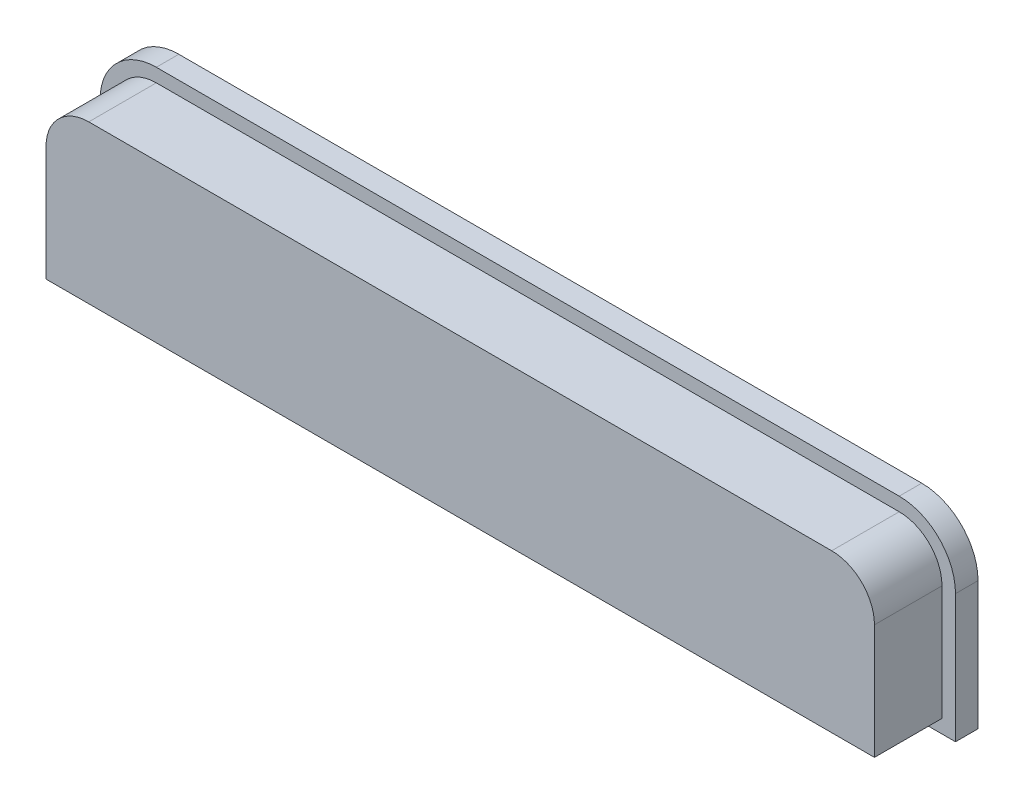
ISO-10303-21;
HEADER;
FILE_DESCRIPTION(('STEP AP214'),'2;1');
FILE_NAME('part.step','',(''),(''),'','','');
FILE_SCHEMA(('AUTOMOTIVE_DESIGN { 1 0 10303 214 1 1 1 1 }'));
ENDSEC;
DATA;
#1=APPLICATION_CONTEXT('core data for automotive mechanical design processes');
#2=APPLICATION_PROTOCOL_DEFINITION('international standard','automotive_design',2000,#1);
#3=PRODUCT_CONTEXT('',#1,'mechanical');
#4=PRODUCT('Part','Part','',(#3));
#5=PRODUCT_RELATED_PRODUCT_CATEGORY('part','',(#4));
#6=PRODUCT_DEFINITION_FORMATION('','',#4);
#7=PRODUCT_DEFINITION_CONTEXT('part definition',#1,'design');
#8=PRODUCT_DEFINITION('design','',#6,#7);
#9=PRODUCT_DEFINITION_SHAPE('','',#8);
#10=(LENGTH_UNIT() NAMED_UNIT(*) SI_UNIT(.MILLI.,.METRE.));
#11=(NAMED_UNIT(*) PLANE_ANGLE_UNIT() SI_UNIT($,.RADIAN.));
#12=(NAMED_UNIT(*) SI_UNIT($,.STERADIAN.) SOLID_ANGLE_UNIT());
#13=UNCERTAINTY_MEASURE_WITH_UNIT(LENGTH_MEASURE(1.E-05),#10,'distance_accuracy_value','');
#14=(GEOMETRIC_REPRESENTATION_CONTEXT(3) GLOBAL_UNCERTAINTY_ASSIGNED_CONTEXT((#13)) GLOBAL_UNIT_ASSIGNED_CONTEXT((#10,
#11,#12)) REPRESENTATION_CONTEXT('',''));
#15=CARTESIAN_POINT('',(0.,0.,0.));
#16=DIRECTION('',(0.,0.,1.));
#17=DIRECTION('',(1.,0.,0.));
#18=AXIS2_PLACEMENT_3D('',#15,#16,#17);
#19=CARTESIAN_POINT('',(2.5,5.69999999999999,1.));
#20=DIRECTION('',(0.,0.,-1.));
#21=DIRECTION('',(-1.,0.,0.));
#22=AXIS2_PLACEMENT_3D('',#19,#20,#21);
#23=PLANE('',#22);
#24=DIRECTION('',(1.,0.,0.));
#25=VECTOR('',#24,1.);
#26=CARTESIAN_POINT('',(38.,0.,1.));
#27=LINE('',#26,#25);
#28=CARTESIAN_POINT('',(0.,0.,1.));
#29=VERTEX_POINT('',#28);
#30=CARTESIAN_POINT('',(38.,0.,1.));
#31=VERTEX_POINT('',#30);
#32=EDGE_CURVE('E157',#29,#31,#27,.T.);
#33=ORIENTED_EDGE('',*,*,#32,.T.);
#34=DIRECTION('',(0.,1.,0.));
#35=VECTOR('',#34,1.);
#36=CARTESIAN_POINT('',(38.,5.69999999999999,1.));
#37=LINE('',#36,#35);
#38=CARTESIAN_POINT('',(38.,5.69999999999999,1.));
#39=VERTEX_POINT('',#38);
#40=EDGE_CURVE('E160',#31,#39,#37,.T.);
#41=ORIENTED_EDGE('',*,*,#40,.T.);
#42=CARTESIAN_POINT('',(35.5,5.69999999999999,1.));
#43=DIRECTION('',(0.,0.,1.));
#44=DIRECTION('',(-1.,0.,0.));
#45=AXIS2_PLACEMENT_3D('',#42,#43,#44);
#46=CIRCLE('',#45,2.5);
#47=CARTESIAN_POINT('',(35.5,8.19999999999999,1.));
#48=VERTEX_POINT('',#47);
#49=EDGE_CURVE('E163',#39,#48,#46,.T.);
#50=ORIENTED_EDGE('',*,*,#49,.T.);
#51=DIRECTION('',(-1.,0.,0.));
#52=VECTOR('',#51,1.);
#53=CARTESIAN_POINT('',(2.5,8.2,1.));
#54=LINE('',#53,#52);
#55=CARTESIAN_POINT('',(2.5,8.2,1.));
#56=VERTEX_POINT('',#55);
#57=EDGE_CURVE('E165',#48,#56,#54,.T.);
#58=ORIENTED_EDGE('',*,*,#57,.T.);
#59=CARTESIAN_POINT('',(2.5,5.69999999999999,1.));
#60=DIRECTION('',(0.,0.,1.));
#61=DIRECTION('',(-1.,0.,0.));
#62=AXIS2_PLACEMENT_3D('',#59,#60,#61);
#63=CIRCLE('',#62,2.5);
#64=CARTESIAN_POINT('',(0.,5.69999999999999,1.));
#65=VERTEX_POINT('',#64);
#66=EDGE_CURVE('E167',#56,#65,#63,.T.);
#67=ORIENTED_EDGE('',*,*,#66,.T.);
#68=DIRECTION('',(0.,-1.,0.));
#69=VECTOR('',#68,1.);
#70=CARTESIAN_POINT('',(0.,0.,1.));
#71=LINE('',#70,#69);
#72=EDGE_CURVE('E169',#65,#29,#71,.T.);
#73=ORIENTED_EDGE('',*,*,#72,.T.);
#74=EDGE_LOOP('',(#33,#41,#50,#58,#67,#73));
#75=FACE_BOUND('',#74,.T.);
#76=DIRECTION('',(1.,0.,0.));
#77=VECTOR('',#76,1.);
#78=CARTESIAN_POINT('',(37.4,0.600000000000004,1.));
#79=LINE('',#78,#77);
#80=CARTESIAN_POINT('',(0.599999999999997,0.6,1.));
#81=VERTEX_POINT('',#80);
#82=CARTESIAN_POINT('',(37.4,0.600000000000004,1.));
#83=VERTEX_POINT('',#82);
#84=EDGE_CURVE('E54',#81,#83,#79,.T.);
#85=ORIENTED_EDGE('',*,*,#84,.F.);
#86=DIRECTION('',(0.,-1.,0.));
#87=VECTOR('',#86,1.);
#88=CARTESIAN_POINT('',(0.599999999999997,0.6,1.));
#89=LINE('',#88,#87);
#90=CARTESIAN_POINT('',(0.599999999999997,5.69999999999999,1.));
#91=VERTEX_POINT('',#90);
#92=EDGE_CURVE('E58',#91,#81,#89,.T.);
#93=ORIENTED_EDGE('',*,*,#92,.F.);
#94=CARTESIAN_POINT('',(2.5,5.69999999999999,1.));
#95=DIRECTION('',(0.,0.,1.));
#96=DIRECTION('',(-1.,0.,0.));
#97=AXIS2_PLACEMENT_3D('',#94,#95,#96);
#98=CIRCLE('',#97,1.9);
#99=CARTESIAN_POINT('',(2.5,7.6,1.));
#100=VERTEX_POINT('',#99);
#101=EDGE_CURVE('E351',#100,#91,#98,.T.);
#102=ORIENTED_EDGE('',*,*,#101,.F.);
#103=DIRECTION('',(-1.,0.,0.));
#104=VECTOR('',#103,1.);
#105=CARTESIAN_POINT('',(2.5,7.6,1.));
#106=LINE('',#105,#104);
#107=CARTESIAN_POINT('',(35.5,7.6,1.));
#108=VERTEX_POINT('',#107);
#109=EDGE_CURVE('E366',#108,#100,#106,.T.);
#110=ORIENTED_EDGE('',*,*,#109,.F.);
#111=CARTESIAN_POINT('',(35.5,5.69999999999999,1.));
#112=DIRECTION('',(0.,0.,1.));
#113=DIRECTION('',(-1.,0.,0.));
#114=AXIS2_PLACEMENT_3D('',#111,#112,#113);
#115=CIRCLE('',#114,1.90000000000001);
#116=CARTESIAN_POINT('',(37.4,5.69999999999999,1.));
#117=VERTEX_POINT('',#116);
#118=EDGE_CURVE('E369',#117,#108,#115,.T.);
#119=ORIENTED_EDGE('',*,*,#118,.F.);
#120=DIRECTION('',(0.,1.,0.));
#121=VECTOR('',#120,1.);
#122=CARTESIAN_POINT('',(37.4,5.69999999999999,1.));
#123=LINE('',#122,#121);
#124=EDGE_CURVE('E370',#83,#117,#123,.T.);
#125=ORIENTED_EDGE('',*,*,#124,.F.);
#126=EDGE_LOOP('',(#85,#93,#102,#110,#119,#125));
#127=FACE_BOUND('',#126,.T.);
#128=ADVANCED_FACE('F39',(#75,#127),#23,.F.);
#129=CARTESIAN_POINT('',(38.,0.,1.));
#130=DIRECTION('',(0.,1.,0.));
#131=DIRECTION('',(-1.,0.,0.));
#132=AXIS2_PLACEMENT_3D('',#129,#130,#131);
#133=PLANE('',#132);
#134=DIRECTION('',(1.,0.,0.));
#135=VECTOR('',#134,1.);
#136=CARTESIAN_POINT('',(38.,0.,0.));
#137=LINE('',#136,#135);
#138=CARTESIAN_POINT('',(0.,0.,0.));
#139=VERTEX_POINT('',#138);
#140=CARTESIAN_POINT('',(38.,0.,0.));
#141=VERTEX_POINT('',#140);
#142=EDGE_CURVE('E148',#139,#141,#137,.T.);
#143=ORIENTED_EDGE('',*,*,#142,.T.);
#144=DIRECTION('',(0.,0.,-1.));
#145=VECTOR('',#144,1.);
#146=CARTESIAN_POINT('',(38.,0.,1.));
#147=LINE('',#146,#145);
#148=EDGE_CURVE('E11',#31,#141,#147,.T.);
#149=ORIENTED_EDGE('',*,*,#148,.F.);
#150=ORIENTED_EDGE('',*,*,#32,.F.);
#151=DIRECTION('',(0.,0.,-1.));
#152=VECTOR('',#151,1.);
#153=CARTESIAN_POINT('',(0.,0.,1.));
#154=LINE('',#153,#152);
#155=EDGE_CURVE('E170',#29,#139,#154,.T.);
#156=ORIENTED_EDGE('',*,*,#155,.T.);
#157=EDGE_LOOP('',(#143,#149,#150,#156));
#158=FACE_BOUND('',#157,.T.);
#159=ADVANCED_FACE('F41',(#158),#133,.F.);
#160=CARTESIAN_POINT('',(38.,5.69999999999999,1.));
#161=DIRECTION('',(-1.,0.,0.));
#162=DIRECTION('',(0.,-1.,0.));
#163=AXIS2_PLACEMENT_3D('',#160,#161,#162);
#164=PLANE('',#163);
#165=DIRECTION('',(0.,1.,0.));
#166=VECTOR('',#165,1.);
#167=CARTESIAN_POINT('',(38.,5.69999999999999,0.));
#168=LINE('',#167,#166);
#169=CARTESIAN_POINT('',(38.,5.69999999999999,0.));
#170=VERTEX_POINT('',#169);
#171=EDGE_CURVE('E151',#141,#170,#168,.T.);
#172=ORIENTED_EDGE('',*,*,#171,.T.);
#173=DIRECTION('',(0.,0.,-1.));
#174=VECTOR('',#173,1.);
#175=CARTESIAN_POINT('',(38.,5.69999999999999,1.));
#176=LINE('',#175,#174);
#177=EDGE_CURVE('E47',#39,#170,#176,.T.);
#178=ORIENTED_EDGE('',*,*,#177,.F.);
#179=ORIENTED_EDGE('',*,*,#40,.F.);
#180=ORIENTED_EDGE('',*,*,#148,.T.);
#181=EDGE_LOOP('',(#172,#178,#179,#180));
#182=FACE_BOUND('',#181,.T.);
#183=ADVANCED_FACE('F217',(#182),#164,.F.);
#184=CARTESIAN_POINT('',(35.5,5.69999999999999,1.));
#185=DIRECTION('',(0.,0.,-1.));
#186=DIRECTION('',(-1.,0.,0.));
#187=AXIS2_PLACEMENT_3D('',#184,#185,#186);
#188=CYLINDRICAL_SURFACE('',#187,2.5);
#189=CARTESIAN_POINT('',(35.5,5.69999999999999,0.));
#190=DIRECTION('',(0.,0.,1.));
#191=DIRECTION('',(-1.,0.,0.));
#192=AXIS2_PLACEMENT_3D('',#189,#190,#191);
#193=CIRCLE('',#192,2.5);
#194=CARTESIAN_POINT('',(35.5,8.19999999999999,0.));
#195=VERTEX_POINT('',#194);
#196=EDGE_CURVE('E173',#170,#195,#193,.T.);
#197=ORIENTED_EDGE('',*,*,#196,.T.);
#198=DIRECTION('',(0.,0.,-1.));
#199=VECTOR('',#198,1.);
#200=CARTESIAN_POINT('',(35.5,8.19999999999999,1.));
#201=LINE('',#200,#199);
#202=EDGE_CURVE('E188',#48,#195,#201,.T.);
#203=ORIENTED_EDGE('',*,*,#202,.F.);
#204=ORIENTED_EDGE('',*,*,#49,.F.);
#205=ORIENTED_EDGE('',*,*,#177,.T.);
#206=EDGE_LOOP('',(#197,#203,#204,#205));
#207=FACE_BOUND('',#206,.T.);
#208=ADVANCED_FACE('F195',(#207),#188,.T.);
#209=CARTESIAN_POINT('',(2.5,8.2,1.));
#210=DIRECTION('',(0.,-1.,0.));
#211=DIRECTION('',(1.,0.,0.));
#212=AXIS2_PLACEMENT_3D('',#209,#210,#211);
#213=PLANE('',#212);
#214=DIRECTION('',(-1.,0.,0.));
#215=VECTOR('',#214,1.);
#216=CARTESIAN_POINT('',(2.5,8.2,0.));
#217=LINE('',#216,#215);
#218=CARTESIAN_POINT('',(2.5,8.2,0.));
#219=VERTEX_POINT('',#218);
#220=EDGE_CURVE('E175',#195,#219,#217,.T.);
#221=ORIENTED_EDGE('',*,*,#220,.T.);
#222=DIRECTION('',(0.,0.,-1.));
#223=VECTOR('',#222,1.);
#224=CARTESIAN_POINT('',(2.5,8.2,1.));
#225=LINE('',#224,#223);
#226=EDGE_CURVE('E185',#56,#219,#225,.T.);
#227=ORIENTED_EDGE('',*,*,#226,.F.);
#228=ORIENTED_EDGE('',*,*,#57,.F.);
#229=ORIENTED_EDGE('',*,*,#202,.T.);
#230=EDGE_LOOP('',(#221,#227,#228,#229));
#231=FACE_BOUND('',#230,.T.);
#232=ADVANCED_FACE('F206',(#231),#213,.F.);
#233=CARTESIAN_POINT('',(2.5,5.69999999999999,1.));
#234=DIRECTION('',(0.,0.,-1.));
#235=DIRECTION('',(-1.,0.,0.));
#236=AXIS2_PLACEMENT_3D('',#233,#234,#235);
#237=CYLINDRICAL_SURFACE('',#236,2.5);
#238=CARTESIAN_POINT('',(2.5,5.69999999999999,0.));
#239=DIRECTION('',(0.,0.,1.));
#240=DIRECTION('',(-1.,0.,0.));
#241=AXIS2_PLACEMENT_3D('',#238,#239,#240);
#242=CIRCLE('',#241,2.5);
#243=CARTESIAN_POINT('',(0.,5.69999999999999,0.));
#244=VERTEX_POINT('',#243);
#245=EDGE_CURVE('E177',#219,#244,#242,.T.);
#246=ORIENTED_EDGE('',*,*,#245,.T.);
#247=DIRECTION('',(0.,0.,-1.));
#248=VECTOR('',#247,1.);
#249=CARTESIAN_POINT('',(0.,5.69999999999999,1.));
#250=LINE('',#249,#248);
#251=EDGE_CURVE('E182',#65,#244,#250,.T.);
#252=ORIENTED_EDGE('',*,*,#251,.F.);
#253=ORIENTED_EDGE('',*,*,#66,.F.);
#254=ORIENTED_EDGE('',*,*,#226,.T.);
#255=EDGE_LOOP('',(#246,#252,#253,#254));
#256=FACE_BOUND('',#255,.T.);
#257=ADVANCED_FACE('F210',(#256),#237,.T.);
#258=CARTESIAN_POINT('',(0.,0.,1.));
#259=DIRECTION('',(1.,0.,0.));
#260=DIRECTION('',(0.,0.,-1.));
#261=AXIS2_PLACEMENT_3D('',#258,#259,#260);
#262=PLANE('',#261);
#263=DIRECTION('',(0.,-1.,0.));
#264=VECTOR('',#263,1.);
#265=CARTESIAN_POINT('',(0.,0.,0.));
#266=LINE('',#265,#264);
#267=EDGE_CURVE('E161',#244,#139,#266,.T.);
#268=ORIENTED_EDGE('',*,*,#267,.T.);
#269=ORIENTED_EDGE('',*,*,#155,.F.);
#270=ORIENTED_EDGE('',*,*,#72,.F.);
#271=ORIENTED_EDGE('',*,*,#251,.T.);
#272=EDGE_LOOP('',(#268,#269,#270,#271));
#273=FACE_BOUND('',#272,.T.);
#274=ADVANCED_FACE('F220',(#273),#262,.F.);
#275=CARTESIAN_POINT('',(2.5,5.69999999999999,0.));
#276=DIRECTION('',(0.,0.,-1.));
#277=DIRECTION('',(-1.,0.,0.));
#278=AXIS2_PLACEMENT_3D('',#275,#276,#277);
#279=PLANE('',#278);
#280=ORIENTED_EDGE('',*,*,#142,.F.);
#281=ORIENTED_EDGE('',*,*,#267,.F.);
#282=ORIENTED_EDGE('',*,*,#245,.F.);
#283=ORIENTED_EDGE('',*,*,#220,.F.);
#284=ORIENTED_EDGE('',*,*,#196,.F.);
#285=ORIENTED_EDGE('',*,*,#171,.F.);
#286=EDGE_LOOP('',(#280,#281,#282,#283,#284,#285));
#287=FACE_BOUND('',#286,.T.);
#288=ADVANCED_FACE('F201',(#287),#279,.T.);
#289=CARTESIAN_POINT('',(37.4,0.600000000000004,4.));
#290=DIRECTION('',(0.,1.,0.));
#291=DIRECTION('',(-1.,0.,0.));
#292=AXIS2_PLACEMENT_3D('',#289,#290,#291);
#293=PLANE('',#292);
#294=ORIENTED_EDGE('',*,*,#84,.T.);
#295=DIRECTION('',(0.,0.,-1.));
#296=VECTOR('',#295,1.);
#297=CARTESIAN_POINT('',(37.4,0.600000000000004,4.));
#298=LINE('',#297,#296);
#299=CARTESIAN_POINT('',(37.4,0.600000000000004,4.));
#300=VERTEX_POINT('',#299);
#301=EDGE_CURVE('E131',#300,#83,#298,.T.);
#302=ORIENTED_EDGE('',*,*,#301,.F.);
#303=DIRECTION('',(1.,0.,0.));
#304=VECTOR('',#303,1.);
#305=CARTESIAN_POINT('',(37.4,0.600000000000004,4.));
#306=LINE('',#305,#304);
#307=CARTESIAN_POINT('',(0.599999999999997,0.6,4.));
#308=VERTEX_POINT('',#307);
#309=EDGE_CURVE('E137',#308,#300,#306,.T.);
#310=ORIENTED_EDGE('',*,*,#309,.F.);
#311=DIRECTION('',(0.,0.,-1.));
#312=VECTOR('',#311,1.);
#313=CARTESIAN_POINT('',(0.599999999999997,0.6,4.));
#314=LINE('',#313,#312);
#315=EDGE_CURVE('E348',#308,#81,#314,.T.);
#316=ORIENTED_EDGE('',*,*,#315,.T.);
#317=EDGE_LOOP('',(#294,#302,#310,#316));
#318=FACE_BOUND('',#317,.T.);
#319=ADVANCED_FACE('F147',(#318),#293,.F.);
#320=CARTESIAN_POINT('',(37.4,5.69999999999999,4.));
#321=DIRECTION('',(-1.,0.,0.));
#322=DIRECTION('',(0.,-1.,0.));
#323=AXIS2_PLACEMENT_3D('',#320,#321,#322);
#324=PLANE('',#323);
#325=ORIENTED_EDGE('',*,*,#124,.T.);
#326=DIRECTION('',(0.,0.,-1.));
#327=VECTOR('',#326,1.);
#328=CARTESIAN_POINT('',(37.4,5.69999999999999,4.));
#329=LINE('',#328,#327);
#330=CARTESIAN_POINT('',(37.4,5.69999999999999,4.));
#331=VERTEX_POINT('',#330);
#332=EDGE_CURVE('E133',#331,#117,#329,.T.);
#333=ORIENTED_EDGE('',*,*,#332,.F.);
#334=DIRECTION('',(0.,1.,0.));
#335=VECTOR('',#334,1.);
#336=CARTESIAN_POINT('',(37.4,5.69999999999999,4.));
#337=LINE('',#336,#335);
#338=EDGE_CURVE('E126',#300,#331,#337,.T.);
#339=ORIENTED_EDGE('',*,*,#338,.F.);
#340=ORIENTED_EDGE('',*,*,#301,.T.);
#341=EDGE_LOOP('',(#325,#333,#339,#340));
#342=FACE_BOUND('',#341,.T.);
#343=ADVANCED_FACE('F129',(#342),#324,.F.);
#344=CARTESIAN_POINT('',(35.5,5.69999999999999,4.));
#345=DIRECTION('',(0.,0.,-1.));
#346=DIRECTION('',(-1.,0.,0.));
#347=AXIS2_PLACEMENT_3D('',#344,#345,#346);
#348=CYLINDRICAL_SURFACE('',#347,1.90000000000001);
#349=ORIENTED_EDGE('',*,*,#118,.T.);
#350=DIRECTION('',(0.,0.,-1.));
#351=VECTOR('',#350,1.);
#352=CARTESIAN_POINT('',(35.5,7.6,4.));
#353=LINE('',#352,#351);
#354=CARTESIAN_POINT('',(35.5,7.6,4.));
#355=VERTEX_POINT('',#354);
#356=EDGE_CURVE('E153',#355,#108,#353,.T.);
#357=ORIENTED_EDGE('',*,*,#356,.F.);
#358=CARTESIAN_POINT('',(35.5,5.69999999999999,4.));
#359=DIRECTION('',(0.,0.,1.));
#360=DIRECTION('',(-1.,0.,0.));
#361=AXIS2_PLACEMENT_3D('',#358,#359,#360);
#362=CIRCLE('',#361,1.90000000000001);
#363=EDGE_CURVE('E136',#331,#355,#362,.T.);
#364=ORIENTED_EDGE('',*,*,#363,.F.);
#365=ORIENTED_EDGE('',*,*,#332,.T.);
#366=EDGE_LOOP('',(#349,#357,#364,#365));
#367=FACE_BOUND('',#366,.T.);
#368=ADVANCED_FACE('F239',(#367),#348,.T.);
#369=CARTESIAN_POINT('',(2.5,7.6,4.));
#370=DIRECTION('',(0.,-1.,0.));
#371=DIRECTION('',(0.,0.,-1.));
#372=AXIS2_PLACEMENT_3D('',#369,#370,#371);
#373=PLANE('',#372);
#374=ORIENTED_EDGE('',*,*,#109,.T.);
#375=DIRECTION('',(0.,0.,-1.));
#376=VECTOR('',#375,1.);
#377=CARTESIAN_POINT('',(2.5,7.6,4.));
#378=LINE('',#377,#376);
#379=CARTESIAN_POINT('',(2.5,7.6,4.));
#380=VERTEX_POINT('',#379);
#381=EDGE_CURVE('E354',#380,#100,#378,.T.);
#382=ORIENTED_EDGE('',*,*,#381,.F.);
#383=DIRECTION('',(-1.,0.,0.));
#384=VECTOR('',#383,1.);
#385=CARTESIAN_POINT('',(2.5,7.6,4.));
#386=LINE('',#385,#384);
#387=EDGE_CURVE('E367',#355,#380,#386,.T.);
#388=ORIENTED_EDGE('',*,*,#387,.F.);
#389=ORIENTED_EDGE('',*,*,#356,.T.);
#390=EDGE_LOOP('',(#374,#382,#388,#389));
#391=FACE_BOUND('',#390,.T.);
#392=ADVANCED_FACE('F242',(#391),#373,.F.);
#393=CARTESIAN_POINT('',(2.5,5.69999999999999,4.));
#394=DIRECTION('',(0.,0.,-1.));
#395=DIRECTION('',(-1.,0.,0.));
#396=AXIS2_PLACEMENT_3D('',#393,#394,#395);
#397=CYLINDRICAL_SURFACE('',#396,1.9);
#398=ORIENTED_EDGE('',*,*,#101,.T.);
#399=DIRECTION('',(0.,0.,-1.));
#400=VECTOR('',#399,1.);
#401=CARTESIAN_POINT('',(0.599999999999997,5.69999999999999,4.));
#402=LINE('',#401,#400);
#403=CARTESIAN_POINT('',(0.599999999999997,5.69999999999999,4.));
#404=VERTEX_POINT('',#403);
#405=EDGE_CURVE('E350',#404,#91,#402,.T.);
#406=ORIENTED_EDGE('',*,*,#405,.F.);
#407=CARTESIAN_POINT('',(2.5,5.69999999999999,4.));
#408=DIRECTION('',(0.,0.,1.));
#409=DIRECTION('',(-1.,0.,0.));
#410=AXIS2_PLACEMENT_3D('',#407,#408,#409);
#411=CIRCLE('',#410,1.9);
#412=EDGE_CURVE('E356',#380,#404,#411,.T.);
#413=ORIENTED_EDGE('',*,*,#412,.F.);
#414=ORIENTED_EDGE('',*,*,#381,.T.);
#415=EDGE_LOOP('',(#398,#406,#413,#414));
#416=FACE_BOUND('',#415,.T.);
#417=ADVANCED_FACE('F246',(#416),#397,.T.);
#418=CARTESIAN_POINT('',(0.599999999999997,0.6,4.));
#419=DIRECTION('',(1.,0.,0.));
#420=DIRECTION('',(0.,0.,-1.));
#421=AXIS2_PLACEMENT_3D('',#418,#419,#420);
#422=PLANE('',#421);
#423=ORIENTED_EDGE('',*,*,#92,.T.);
#424=ORIENTED_EDGE('',*,*,#315,.F.);
#425=DIRECTION('',(0.,-1.,0.));
#426=VECTOR('',#425,1.);
#427=CARTESIAN_POINT('',(0.599999999999997,0.6,4.));
#428=LINE('',#427,#426);
#429=EDGE_CURVE('E142',#404,#308,#428,.T.);
#430=ORIENTED_EDGE('',*,*,#429,.F.);
#431=ORIENTED_EDGE('',*,*,#405,.T.);
#432=EDGE_LOOP('',(#423,#424,#430,#431));
#433=FACE_BOUND('',#432,.T.);
#434=ADVANCED_FACE('F250',(#433),#422,.F.);
#435=CARTESIAN_POINT('',(2.5,5.69999999999999,4.));
#436=DIRECTION('',(0.,0.,-1.));
#437=DIRECTION('',(-1.,0.,0.));
#438=AXIS2_PLACEMENT_3D('',#435,#436,#437);
#439=PLANE('',#438);
#440=ORIENTED_EDGE('',*,*,#309,.T.);
#441=ORIENTED_EDGE('',*,*,#338,.T.);
#442=ORIENTED_EDGE('',*,*,#363,.T.);
#443=ORIENTED_EDGE('',*,*,#387,.T.);
#444=ORIENTED_EDGE('',*,*,#412,.T.);
#445=ORIENTED_EDGE('',*,*,#429,.T.);
#446=EDGE_LOOP('',(#440,#441,#442,#443,#444,#445));
#447=FACE_BOUND('',#446,.T.);
#448=ADVANCED_FACE('F140',(#447),#439,.F.);
#449=CLOSED_SHELL('',(#128,#159,#183,#208,#232,#257,#274,#288,#319,#343,#368,#392,#417,#434,#448));
#450=MANIFOLD_SOLID_BREP('B2',#449);
#451=ADVANCED_BREP_SHAPE_REPRESENTATION('',(#18,#450),#14);
#452=SHAPE_DEFINITION_REPRESENTATION(#9,#451);
ENDSEC;
END-ISO-10303-21;
